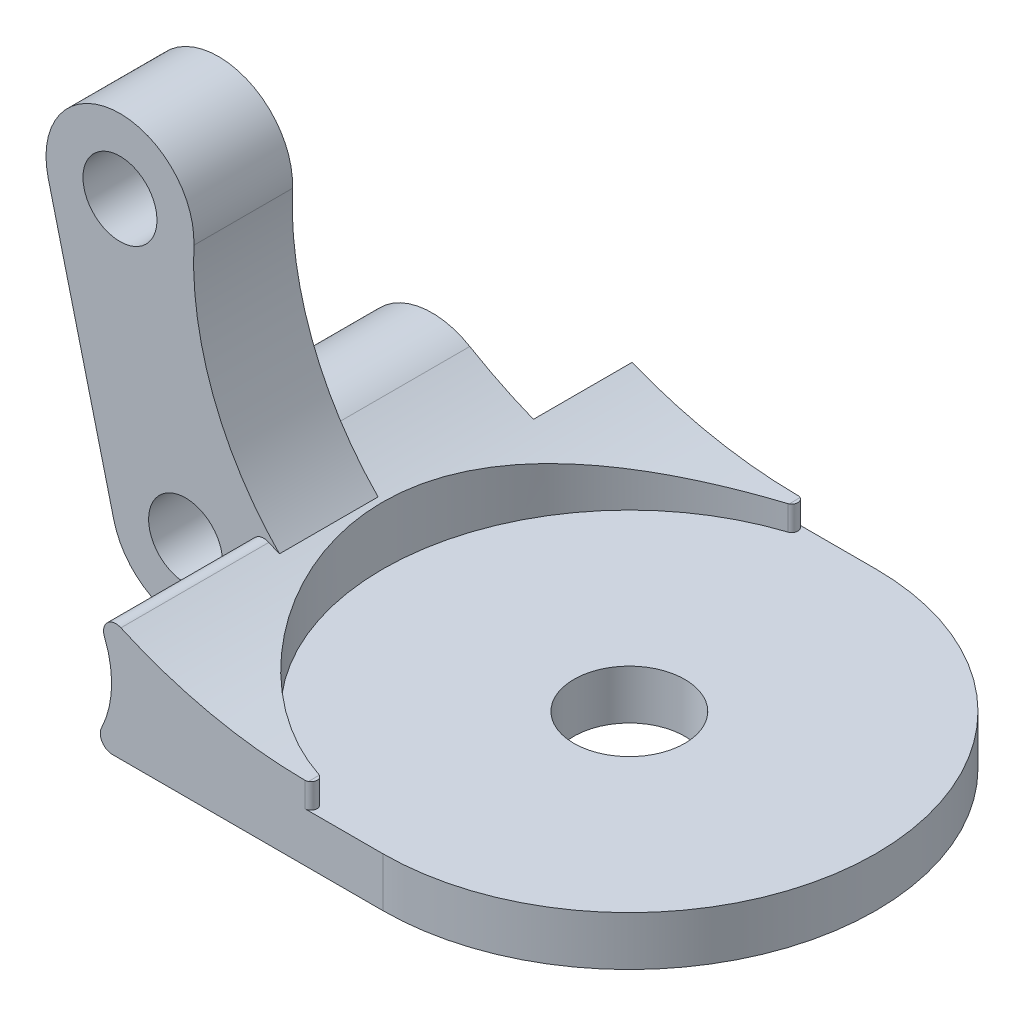
ISO-10303-21;
HEADER;
FILE_DESCRIPTION(('STEP AP214'),'2;1');
FILE_NAME('part.step','',(''),(''),'','','');
FILE_SCHEMA(('AUTOMOTIVE_DESIGN { 1 0 10303 214 1 1 1 1 }'));
ENDSEC;
DATA;
#1=APPLICATION_CONTEXT('core data for automotive mechanical design processes');
#2=APPLICATION_PROTOCOL_DEFINITION('international standard','automotive_design',2000,#1);
#3=PRODUCT_CONTEXT('',#1,'mechanical');
#4=PRODUCT('Part','Part','',(#3));
#5=PRODUCT_RELATED_PRODUCT_CATEGORY('part','',(#4));
#6=PRODUCT_DEFINITION_FORMATION('','',#4);
#7=PRODUCT_DEFINITION_CONTEXT('part definition',#1,'design');
#8=PRODUCT_DEFINITION('design','',#6,#7);
#9=PRODUCT_DEFINITION_SHAPE('','',#8);
#10=(LENGTH_UNIT() NAMED_UNIT(*) SI_UNIT(.MILLI.,.METRE.));
#11=(NAMED_UNIT(*) PLANE_ANGLE_UNIT() SI_UNIT($,.RADIAN.));
#12=(NAMED_UNIT(*) SI_UNIT($,.STERADIAN.) SOLID_ANGLE_UNIT());
#13=UNCERTAINTY_MEASURE_WITH_UNIT(LENGTH_MEASURE(1.E-05),#10,'distance_accuracy_value','');
#14=(GEOMETRIC_REPRESENTATION_CONTEXT(3) GLOBAL_UNCERTAINTY_ASSIGNED_CONTEXT((#13)) GLOBAL_UNIT_ASSIGNED_CONTEXT((#10,
#11,#12)) REPRESENTATION_CONTEXT('',''));
#15=CARTESIAN_POINT('',(0.,0.,0.));
#16=DIRECTION('',(0.,0.,1.));
#17=DIRECTION('',(1.,0.,0.));
#18=AXIS2_PLACEMENT_3D('',#15,#16,#17);
#19=CARTESIAN_POINT('',(-3.04554884989668,21.5,-10.));
#20=DIRECTION('',(0.,0.,1.));
#21=DIRECTION('',(-1.,0.,0.));
#22=AXIS2_PLACEMENT_3D('',#19,#20,#21);
#23=CYLINDRICAL_SURFACE('',#22,18.5);
#24=CARTESIAN_POINT('',(-3.04554884989668,21.5,0.));
#25=DIRECTION('',(0.,0.,1.));
#26=DIRECTION('',(1.,0.,0.));
#27=AXIS2_PLACEMENT_3D('',#24,#25,#26);
#28=CIRCLE('',#27,18.5);
#29=CARTESIAN_POINT('',(-10.1925249558174,4.43627436515113,0.));
#30=VERTEX_POINT('',#29);
#31=CARTESIAN_POINT('',(-12.4714719325437,5.58139534883721,0.));
#32=VERTEX_POINT('',#31);
#33=EDGE_CURVE('E177',#30,#32,#28,.F.);
#34=ORIENTED_EDGE('',*,*,#33,.F.);
#35=DIRECTION('',(0.,0.,1.));
#36=VECTOR('',#35,1.);
#37=CARTESIAN_POINT('',(-10.1925249558174,4.43627436515113,3.));
#38=LINE('',#37,#36);
#39=CARTESIAN_POINT('',(-10.1925249558174,4.43627436515113,4.));
#40=VERTEX_POINT('',#39);
#41=EDGE_CURVE('E175',#30,#40,#38,.T.);
#42=ORIENTED_EDGE('',*,*,#41,.T.);
#43=CARTESIAN_POINT('',(-3.04554884989668,21.5,4.));
#44=DIRECTION('',(0.,0.,-1.));
#45=DIRECTION('',(-1.,0.,0.));
#46=AXIS2_PLACEMENT_3D('',#43,#44,#45);
#47=CIRCLE('',#46,18.5);
#48=CARTESIAN_POINT('',(-10.6224737968789,4.62279026770719,4.));
#49=VERTEX_POINT('',#48);
#50=EDGE_CURVE('E349',#40,#49,#47,.T.);
#51=ORIENTED_EDGE('',*,*,#50,.T.);
#52=DIRECTION('',(0.,0.,1.));
#53=VECTOR('',#52,1.);
#54=CARTESIAN_POINT('',(-10.6224737968789,4.62279026770719,-10.));
#55=LINE('',#54,#53);
#56=CARTESIAN_POINT('',(-10.6224737968789,4.62279026770719,10.));
#57=VERTEX_POINT('',#56);
#58=EDGE_CURVE('E336',#57,#49,#55,.F.);
#59=ORIENTED_EDGE('',*,*,#58,.F.);
#60=CARTESIAN_POINT('',(-3.04554884989668,21.5,10.));
#61=DIRECTION('',(0.,0.,-1.));
#62=DIRECTION('',(-1.,0.,0.));
#63=AXIS2_PLACEMENT_3D('',#60,#61,#62);
#64=CIRCLE('',#63,18.5);
#65=CARTESIAN_POINT('',(-3.16227766016838,3.0003682635342,10.));
#66=VERTEX_POINT('',#65);
#67=EDGE_CURVE('E318',#57,#66,#64,.F.);
#68=ORIENTED_EDGE('',*,*,#67,.T.);
#69=CARTESIAN_POINT('',(-3.16227766016838,3.0003682635342,10.));
#70=CARTESIAN_POINT('',(-3.1480853813417,3.00027804290709,10.000015644037));
#71=CARTESIAN_POINT('',(-3.13388447461471,3.00020542840582,9.99879238895811));
#72=CARTESIAN_POINT('',(-3.10617274926587,3.0000944187745,9.99401613107568));
#73=CARTESIAN_POINT('',(-3.09265380670172,3.00005536764884,9.99051026220847));
#74=CARTESIAN_POINT('',(-3.07372003582073,3.00002051332476,9.98387129438531));
#75=CARTESIAN_POINT('',(-3.06798546811532,3.00001273660406,9.98161826192571));
#76=CARTESIAN_POINT('',(-3.05664720659696,3.00000246065968,9.97667306088629));
#77=CARTESIAN_POINT('',(-3.05104516087369,3.0000000096958,9.97397711283714));
#78=CARTESIAN_POINT('',(-3.04554884989668,3.,9.97107551843783));
#79=B_SPLINE_CURVE_WITH_KNOTS('',3,(#69,#70,#71,#72,#73,#74,#75,#76,#77,#78),.UNSPECIFIED.,.F.,
.F.,(4,2,2,2,4),(0.,0.0425439994481276,0.0842362303649804,0.102705805734802,0.121342058674472),.UNSPECIFIED.);
#80=CARTESIAN_POINT('',(-3.04554884989668,3.,9.97107551843782));
#81=VERTEX_POINT('',#80);
#82=EDGE_CURVE('E320',#66,#81,#79,.T.);
#83=ORIENTED_EDGE('',*,*,#82,.T.);
#84=DIRECTION('',(0.,0.,1.));
#85=VECTOR('',#84,1.);
#86=CARTESIAN_POINT('',(-3.04554884989668,3.,0.));
#87=LINE('',#86,#85);
#88=CARTESIAN_POINT('',(-3.04554884989668,3.,9.52892448156218));
#89=VERTEX_POINT('',#88);
#90=EDGE_CURVE('E262',#81,#89,#87,.F.);
#91=ORIENTED_EDGE('',*,*,#90,.T.);
#92=CARTESIAN_POINT('',(-3.04554884989668,3.,9.52892448156218));
#93=CARTESIAN_POINT('',(-3.05190870122854,2.99999974529206,9.52556774595884));
#94=CARTESIAN_POINT('',(-3.05838863413223,3.00000314984952,9.52249526485625));
#95=CARTESIAN_POINT('',(-3.07158866308321,3.00001727749524,9.51691881165259));
#96=CARTESIAN_POINT('',(-3.07830875913051,3.0000280005835,9.51441483955152));
#97=CARTESIAN_POINT('',(-3.08514893674962,3.00004238293716,9.51219512195119));
#98=B_SPLINE_CURVE_WITH_KNOTS('',3,(#92,#93,#94,#95,#96,#97),.UNSPECIFIED.,.F.,.F.,(4,2,4),(0.,
0.0215143472914588,0.0430286945827911),.UNSPECIFIED.);
#99=CARTESIAN_POINT('',(-3.08514893674964,3.00004238293716,9.51219512195122));
#100=VERTEX_POINT('',#99);
#101=EDGE_CURVE('E268',#89,#100,#98,.T.);
#102=ORIENTED_EDGE('',*,*,#101,.T.);
#103=CARTESIAN_POINT('',(-3.08514893674964,3.00004238293716,9.51219512195122));
#104=CARTESIAN_POINT('',(-3.34375948477036,3.00055533957409,9.42836322217349));
#105=CARTESIAN_POINT('',(-3.59885969231946,3.00656320139904,9.33392785749339));
#106=CARTESIAN_POINT('',(-4.10004762303463,3.02838642997198,9.12485938442509));
#107=CARTESIAN_POINT('',(-4.34614044395378,3.04419615551166,9.01023792076904));
#108=CARTESIAN_POINT('',(-4.82668994745182,3.08436607069219,8.76218968885334));
#109=CARTESIAN_POINT('',(-5.06118804985238,3.10869286758296,8.62883756291865));
#110=CARTESIAN_POINT('',(-5.51806622434353,3.16452602423865,8.34406375065127));
#111=CARTESIAN_POINT('',(-5.74044480458999,3.19603326541304,8.19263984707074));
#112=CARTESIAN_POINT('',(-6.17127935430581,3.26466860569798,7.87318810615199));
#113=CARTESIAN_POINT('',(-6.37976296766931,3.3017850332488,7.70519499234052));
#114=CARTESIAN_POINT('',(-6.78223591344763,3.3801429296113,7.35341667886423));
#115=CARTESIAN_POINT('',(-6.97622017223245,3.42138583066662,7.16962599921684));
#116=CARTESIAN_POINT('',(-7.34877393648276,3.50642335745003,6.78725559540884));
#117=CARTESIAN_POINT('',(-7.5273293341186,3.55022025849001,6.58866263897589));
#118=CARTESIAN_POINT('',(-7.86791187371115,3.63870724173569,6.17795586997929));
#119=CARTESIAN_POINT('',(-8.02993830921128,3.68339736202049,5.96584148013147));
#120=CARTESIAN_POINT('',(-8.34512598208159,3.77451335328896,5.51708014686157));
#121=CARTESIAN_POINT('',(-8.4972923848066,3.82089745270518,5.2797248788889));
#122=CARTESIAN_POINT('',(-8.78119193101754,3.91095288352785,4.79271175567846));
#123=CARTESIAN_POINT('',(-8.91293208475502,3.95462514253434,4.54305816013831));
#124=CARTESIAN_POINT('',(-9.15507395698833,4.03746622741688,4.03290579044189));
#125=CARTESIAN_POINT('',(-9.26547763253457,4.07663546619078,3.77240801361527));
#126=CARTESIAN_POINT('',(-9.46403924479765,4.14879968111384,3.24223364097852));
#127=CARTESIAN_POINT('',(-9.55219792711845,4.18179486419437,2.9725573531561));
#128=CARTESIAN_POINT('',(-9.704689480044,4.23985957361651,2.42858097126249));
#129=CARTESIAN_POINT('',(-9.7692469727602,4.26500346943213,2.1543519091016));
#130=CARTESIAN_POINT('',(-9.87506513907689,4.30665966820316,1.60077813563243));
#131=CARTESIAN_POINT('',(-9.91632593620938,4.32317201692779,1.32143345145813));
#132=CARTESIAN_POINT('',(-9.97507210782548,4.34678705090587,0.759980459873877));
#133=CARTESIAN_POINT('',(-9.99256801399594,4.35389390427771,0.477873432492562));
#134=CARTESIAN_POINT('',(-10.0036096970231,4.35837140966839,-0.0868786110712942));
#135=CARTESIAN_POINT('',(-9.99715674706311,4.3557425792614,-0.369523597856082));
#136=CARTESIAN_POINT('',(-9.96162148359995,4.34137938731528,-0.914037638366749));
#137=CARTESIAN_POINT('',(-9.93408946483071,4.3302689744324,-1.17602611745195));
#138=CARTESIAN_POINT('',(-9.85854202920388,4.30015186478646,-1.69655783114857));
#139=CARTESIAN_POINT('',(-9.81052758875707,4.28114554442774,-1.95510122938352));
#140=CARTESIAN_POINT('',(-9.69447212446267,4.23600027012829,-2.46700078063961));
#141=CARTESIAN_POINT('',(-9.62643152447513,4.20986146714968,-2.72035704332675));
#142=CARTESIAN_POINT('',(-9.47088408714956,4.15145646157184,-3.22039513502773));
#143=CARTESIAN_POINT('',(-9.38336959265147,4.11918784945617,-3.46707429568407));
#144=CARTESIAN_POINT('',(-9.18807988054015,4.04920549955487,-3.95594939128155));
#145=CARTESIAN_POINT('',(-9.08001405773094,4.01141572565752,-4.19801823218417));
#146=CARTESIAN_POINT('',(-8.84524581424566,3.93216395392889,-4.672441651066));
#147=CARTESIAN_POINT('',(-8.71853519033863,3.89070034291524,-4.9047918950282));
#148=CARTESIAN_POINT('',(-8.44725861594383,3.80560146346534,-5.35851765936131));
#149=CARTESIAN_POINT('',(-8.30268629843897,3.76196542396903,-5.57988922661522));
#150=CARTESIAN_POINT('',(-7.9965380367714,3.67409004510057,-6.0104207809255));
#151=CARTESIAN_POINT('',(-7.83496154887912,3.62985068647592,-6.21958037715616));
#152=CARTESIAN_POINT('',(-7.48384715070279,3.53930371311177,-6.63866350881956));
#153=CARTESIAN_POINT('',(-7.29314636843003,3.49306604764083,-6.84762980391476));
#154=CARTESIAN_POINT('',(-6.89444155889461,3.40365368583366,-7.24890696257339));
#155=CARTESIAN_POINT('',(-6.68644379275847,3.36047789156267,-7.441223801865));
#156=CARTESIAN_POINT('',(-6.25451673604423,3.27911260379688,-7.80776110679517));
#157=CARTESIAN_POINT('',(-6.03060450449051,3.24091789190206,-7.98200047140674));
#158=CARTESIAN_POINT('',(-5.56817957862755,3.17130558810468,-8.31119466539471));
#159=CARTESIAN_POINT('',(-5.32967163486971,3.13988580602933,-8.46615572011384));
#160=CARTESIAN_POINT('',(-4.77014221334346,3.07785014210383,-8.79652493371539));
#161=CARTESIAN_POINT('',(-4.44485013591344,3.0499706499199,-8.96533605476174));
#162=CARTESIAN_POINT('',(-3.94400782918979,3.0210700869984,-9.19121603747753));
#163=CARTESIAN_POINT('',(-3.7748514400196,3.01358934261343,-9.26197217953963));
#164=CARTESIAN_POINT('',(-3.43272065563493,3.00325929164313,-9.39415026003931));
#165=CARTESIAN_POINT('',(-3.2597448566753,3.00041171759843,-9.45556869893083));
#166=CARTESIAN_POINT('',(-3.08514893674963,3.00004238293717,-9.51219512195122));
#167=B_SPLINE_CURVE_WITH_KNOTS('',3,(#103,#104,#105,#106,#107,#108,#109,#110,#111,#112,#113,
#114,#115,#116,#117,#118,#119,#120,#121,#122,#123,#124,#125,#126,#127,#128,#129,#130,#131,#132,
#133,#134,#135,#136,#137,#138,#139,#140,#141,#142,#143,#144,#145,#146,#147,#148,#149,#150,#151,
#152,#153,#154,#155,#156,#157,#158,#159,#160,#161,#162,#163,#164,#165,#166),.UNSPECIFIED.,.F.,
.F.,(4,2,2,2,2,2,2,2,2,2,2,2,2,2,2,2,2,2,2,2,2,2,2,2,2,2,2,2,2,2,2,4),(0.,0.815211361127926,
1.62995398347844,2.44153738248569,3.25322045818732,4.06323726973291,4.8735362090384,
5.6845683969265,6.49563523424888,7.35182898682674,8.20772824172615,9.06354895349464,
9.9193409761969,10.7667618849982,11.6141783002614,12.4612190504607,13.3082147704246,
14.0982757596736,14.8882990903927,15.6783057012177,16.4686234942692,17.2710827161575,
18.0738960609496,18.876996408451,19.6801224438962,20.5390669011686,21.3977017816965,
22.2554297660529,23.1128800503628,24.2126428724185,24.7628894570447,25.3133417551602),.UNSPECIFIED.);
#168=CARTESIAN_POINT('',(-3.08514893674963,3.00004238293716,-9.51219512195122));
#169=VERTEX_POINT('',#168);
#170=EDGE_CURVE('E277',#100,#169,#167,.T.);
#171=ORIENTED_EDGE('',*,*,#170,.T.);
#172=CARTESIAN_POINT('',(-3.08514893674963,3.00004238293716,-9.51219512195122));
#173=CARTESIAN_POINT('',(-3.07830875913051,3.00002800058351,-9.51441483955154));
#174=CARTESIAN_POINT('',(-3.07158866308322,3.00001727749525,-9.51691881165261));
#175=CARTESIAN_POINT('',(-3.05838863413223,3.00000314984952,-9.52249526485624));
#176=CARTESIAN_POINT('',(-3.05190870122853,2.99999974529206,-9.52556774595882));
#177=CARTESIAN_POINT('',(-3.04554884989667,2.99999999999999,-9.52892448156214));
#178=B_SPLINE_CURVE_WITH_KNOTS('',3,(#172,#173,#174,#175,#176,#177),.UNSPECIFIED.,.F.,.F.,(4,2,
4),(0.,0.0215143472913285,0.0430286945827812),.UNSPECIFIED.);
#179=CARTESIAN_POINT('',(-3.04554884989668,3.,-9.52892448156217));
#180=VERTEX_POINT('',#179);
#181=EDGE_CURVE('E302',#169,#180,#178,.T.);
#182=ORIENTED_EDGE('',*,*,#181,.T.);
#183=DIRECTION('',(0.,0.,1.));
#184=VECTOR('',#183,1.);
#185=CARTESIAN_POINT('',(-3.04554884989668,3.,0.));
#186=LINE('',#185,#184);
#187=CARTESIAN_POINT('',(-3.04554884989668,3.,-9.97107551843783));
#188=VERTEX_POINT('',#187);
#189=EDGE_CURVE('E259',#180,#188,#186,.F.);
#190=ORIENTED_EDGE('',*,*,#189,.T.);
#191=CARTESIAN_POINT('',(-3.04554884989668,3.,-9.97107551843783));
#192=CARTESIAN_POINT('',(-3.05809206086548,2.9999993917057,-9.97771607661325));
#193=CARTESIAN_POINT('',(-3.07122128576662,3.00001271934005,-9.98326500967602));
#194=CARTESIAN_POINT('',(-3.09795710215626,3.00006966284216,-9.99198037388416));
#195=CARTESIAN_POINT('',(-3.11154887366791,3.00011266697014,-9.99519228063992));
#196=CARTESIAN_POINT('',(-3.13139173756224,3.00019813922736,-9.99816183103056));
#197=CARTESIAN_POINT('',(-3.13751473920206,3.00022756382609,-9.99884700811873));
#198=CARTESIAN_POINT('',(-3.14985001000346,3.00029299058574,-9.99976793571782));
#199=CARTESIAN_POINT('',(-3.15606258609397,3.00032904970913,-9.99999957460357));
#200=CARTESIAN_POINT('',(-3.16227766016837,3.0003682635342,-10.));
#201=B_SPLINE_CURVE_WITH_KNOTS('',3,(#191,#192,#193,#194,#195,#196,#197,#198,#199,#200),
.UNSPECIFIED.,.F.,.F.,(4,2,2,2,4),(0.,0.0425439996769928,0.0842362303421861,0.102705805693901,
0.12134205865309),.UNSPECIFIED.);
#202=CARTESIAN_POINT('',(-3.16227766016837,3.0003682635342,-10.));
#203=VERTEX_POINT('',#202);
#204=EDGE_CURVE('E308',#188,#203,#201,.T.);
#205=ORIENTED_EDGE('',*,*,#204,.T.);
#206=CARTESIAN_POINT('',(-3.04554884989668,21.5,-10.));
#207=DIRECTION('',(0.,0.,1.));
#208=DIRECTION('',(1.,0.,0.));
#209=AXIS2_PLACEMENT_3D('',#206,#207,#208);
#210=CIRCLE('',#209,18.5);
#211=CARTESIAN_POINT('',(-9.89074408045117,4.3129903050125,-10.));
#212=VERTEX_POINT('',#211);
#213=EDGE_CURVE('E315',#203,#212,#210,.F.);
#214=ORIENTED_EDGE('',*,*,#213,.T.);
#215=DIRECTION('',(0.,0.,-1.));
#216=VECTOR('',#215,1.);
#217=CARTESIAN_POINT('',(-9.89074408045117,4.3129903050125,-6.));
#218=LINE('',#217,#216);
#219=CARTESIAN_POINT('',(-9.89074408045117,4.31299030501251,-6.));
#220=VERTEX_POINT('',#219);
#221=EDGE_CURVE('E197',#220,#212,#218,.T.);
#222=ORIENTED_EDGE('',*,*,#221,.F.);
#223=CARTESIAN_POINT('',(-3.04554884989668,21.5,-6.));
#224=DIRECTION('',(0.,0.,1.));
#225=DIRECTION('',(1.,0.,0.));
#226=AXIS2_PLACEMENT_3D('',#223,#224,#225);
#227=CIRCLE('',#226,18.5);
#228=CARTESIAN_POINT('',(-12.4714719325437,5.58139534883721,-6.));
#229=VERTEX_POINT('',#228);
#230=EDGE_CURVE('E191',#220,#229,#227,.F.);
#231=ORIENTED_EDGE('',*,*,#230,.T.);
#232=DIRECTION('',(0.,0.,1.));
#233=VECTOR('',#232,1.);
#234=CARTESIAN_POINT('',(-12.4714719325437,5.58139534883721,-10.));
#235=LINE('',#234,#233);
#236=EDGE_CURVE('E265',#229,#32,#235,.T.);
#237=ORIENTED_EDGE('',*,*,#236,.T.);
#238=EDGE_LOOP('',(#34,#42,#51,#59,#68,#83,#91,#102,#171,#182,#190,#205,#214,#222,#231,#237));
#239=FACE_BOUND('',#238,.T.);
#240=ADVANCED_FACE('F64',(#239),#23,.F.);
#241=CARTESIAN_POINT('',(-14.,3.,-10.));
#242=DIRECTION('',(0.,0.,1.));
#243=DIRECTION('',(-1.,0.,0.));
#244=AXIS2_PLACEMENT_3D('',#241,#242,#243);
#245=CYLINDRICAL_SURFACE('',#244,3.);
#246=CARTESIAN_POINT('',(-14.,3.,0.));
#247=DIRECTION('',(0.,0.,1.));
#248=DIRECTION('',(1.,0.,0.));
#249=AXIS2_PLACEMENT_3D('',#246,#247,#248);
#250=CIRCLE('',#249,3.);
#251=CARTESIAN_POINT('',(-16.910887178828,2.27423431320099,0.));
#252=VERTEX_POINT('',#251);
#253=EDGE_CURVE('E167',#252,#32,#250,.F.);
#254=ORIENTED_EDGE('',*,*,#253,.T.);
#255=ORIENTED_EDGE('',*,*,#236,.F.);
#256=CARTESIAN_POINT('',(-14.,3.,-6.));
#257=DIRECTION('',(0.,0.,1.));
#258=DIRECTION('',(1.,0.,0.));
#259=AXIS2_PLACEMENT_3D('',#256,#257,#258);
#260=CIRCLE('',#259,3.);
#261=CARTESIAN_POINT('',(-14.,0.,-6.));
#262=VERTEX_POINT('',#261);
#263=EDGE_CURVE('E181',#229,#262,#260,.T.);
#264=ORIENTED_EDGE('',*,*,#263,.T.);
#265=DIRECTION('',(0.,0.,1.));
#266=VECTOR('',#265,1.);
#267=CARTESIAN_POINT('',(-14.,0.,-10.));
#268=LINE('',#267,#266);
#269=CARTESIAN_POINT('',(-14.,0.,4.));
#270=VERTEX_POINT('',#269);
#271=EDGE_CURVE('E211',#262,#270,#268,.T.);
#272=ORIENTED_EDGE('',*,*,#271,.T.);
#273=CARTESIAN_POINT('',(-14.,3.,4.));
#274=DIRECTION('',(0.,0.,-1.));
#275=DIRECTION('',(-1.,0.,0.));
#276=AXIS2_PLACEMENT_3D('',#273,#274,#275);
#277=CIRCLE('',#276,3.);
#278=CARTESIAN_POINT('',(-16.910887178828,2.27423431320099,4.));
#279=VERTEX_POINT('',#278);
#280=EDGE_CURVE('E204',#270,#279,#277,.T.);
#281=ORIENTED_EDGE('',*,*,#280,.T.);
#282=DIRECTION('',(0.,0.,1.));
#283=VECTOR('',#282,1.);
#284=CARTESIAN_POINT('',(-16.910887178828,2.27423431320099,3.));
#285=LINE('',#284,#283);
#286=EDGE_CURVE('E173',#252,#279,#285,.T.);
#287=ORIENTED_EDGE('',*,*,#286,.F.);
#288=EDGE_LOOP('',(#254,#255,#264,#272,#281,#287));
#289=FACE_BOUND('',#288,.T.);
#290=ADVANCED_FACE('F291',(#289),#245,.T.);
#291=CARTESIAN_POINT('',(0.,0.,0.));
#292=DIRECTION('',(0.,1.,0.));
#293=DIRECTION('',(0.,0.,-1.));
#294=AXIS2_PLACEMENT_3D('',#291,#292,#293);
#295=PLANE('',#294);
#296=CARTESIAN_POINT('',(0.,0.,0.));
#297=DIRECTION('',(0.,1.,0.));
#298=DIRECTION('',(0.,0.,1.));
#299=AXIS2_PLACEMENT_3D('',#296,#297,#298);
#300=CIRCLE('',#299,2.25);
#301=CARTESIAN_POINT('',(0.,0.,2.25));
#302=VERTEX_POINT('',#301);
#303=EDGE_CURVE('E347',#302,#302,#300,.T.);
#304=ORIENTED_EDGE('',*,*,#303,.T.);
#305=EDGE_LOOP('',(#304));
#306=FACE_BOUND('',#305,.T.);
#307=DIRECTION('',(0.,0.,-1.));
#308=VECTOR('',#307,1.);
#309=CARTESIAN_POINT('',(-11.0464063496425,0.,-6.));
#310=LINE('',#309,#308);
#311=CARTESIAN_POINT('',(-11.0464063496425,0.,-6.));
#312=VERTEX_POINT('',#311);
#313=CARTESIAN_POINT('',(-11.0464063496425,0.,-10.));
#314=VERTEX_POINT('',#313);
#315=EDGE_CURVE('E195',#312,#314,#310,.T.);
#316=ORIENTED_EDGE('',*,*,#315,.T.);
#317=DIRECTION('',(-1.,0.,0.));
#318=VECTOR('',#317,1.);
#319=CARTESIAN_POINT('',(0.,0.,-10.));
#320=LINE('',#319,#318);
#321=CARTESIAN_POINT('',(0.,0.,-10.));
#322=VERTEX_POINT('',#321);
#323=EDGE_CURVE('E208',#322,#314,#320,.T.);
#324=ORIENTED_EDGE('',*,*,#323,.F.);
#325=CARTESIAN_POINT('',(0.,0.,0.));
#326=DIRECTION('',(0.,-1.,0.));
#327=DIRECTION('',(0.,0.,-1.));
#328=AXIS2_PLACEMENT_3D('',#325,#326,#327);
#329=CIRCLE('',#328,10.);
#330=CARTESIAN_POINT('',(0.,0.,10.));
#331=VERTEX_POINT('',#330);
#332=EDGE_CURVE('E220',#322,#331,#329,.T.);
#333=ORIENTED_EDGE('',*,*,#332,.T.);
#334=DIRECTION('',(1.,0.,0.));
#335=VECTOR('',#334,1.);
#336=CARTESIAN_POINT('',(0.,0.,10.));
#337=LINE('',#336,#335);
#338=CARTESIAN_POINT('',(-10.9599673040044,0.,10.));
#339=VERTEX_POINT('',#338);
#340=EDGE_CURVE('E214',#339,#331,#337,.T.);
#341=ORIENTED_EDGE('',*,*,#340,.F.);
#342=DIRECTION('',(0.,0.,1.));
#343=VECTOR('',#342,1.);
#344=CARTESIAN_POINT('',(-10.9599673040044,0.,0.));
#345=LINE('',#344,#343);
#346=CARTESIAN_POINT('',(-10.9599673040044,0.,4.));
#347=VERTEX_POINT('',#346);
#348=EDGE_CURVE('E327',#347,#339,#345,.T.);
#349=ORIENTED_EDGE('',*,*,#348,.F.);
#350=DIRECTION('',(-1.,0.,0.));
#351=VECTOR('',#350,1.);
#352=CARTESIAN_POINT('',(0.,0.,4.));
#353=LINE('',#352,#351);
#354=EDGE_CURVE('E68',#347,#270,#353,.T.);
#355=ORIENTED_EDGE('',*,*,#354,.T.);
#356=ORIENTED_EDGE('',*,*,#271,.F.);
#357=DIRECTION('',(1.,0.,0.));
#358=VECTOR('',#357,1.);
#359=CARTESIAN_POINT('',(0.,0.,-6.));
#360=LINE('',#359,#358);
#361=EDGE_CURVE('E184',#262,#312,#360,.T.);
#362=ORIENTED_EDGE('',*,*,#361,.T.);
#363=EDGE_LOOP('',(#316,#324,#333,#341,#349,#355,#356,#362));
#364=FACE_BOUND('',#363,.T.);
#365=ADVANCED_FACE('F436',(#306,#364),#295,.F.);
#366=CARTESIAN_POINT('',(0.,3.,-10.));
#367=DIRECTION('',(0.,0.,-1.));
#368=DIRECTION('',(1.,0.,0.));
#369=AXIS2_PLACEMENT_3D('',#366,#367,#368);
#370=PLANE('',#369);
#371=ORIENTED_EDGE('',*,*,#213,.F.);
#372=DIRECTION('',(0.,-1.,0.));
#373=VECTOR('',#372,1.);
#374=CARTESIAN_POINT('',(-3.16227766016837,3.,-10.));
#375=LINE('',#374,#373);
#376=CARTESIAN_POINT('',(-3.16227766016837,2.,-10.));
#377=VERTEX_POINT('',#376);
#378=EDGE_CURVE('E246',#377,#203,#375,.F.);
#379=ORIENTED_EDGE('',*,*,#378,.F.);
#380=DIRECTION('',(-1.,0.,0.));
#381=VECTOR('',#380,1.);
#382=CARTESIAN_POINT('',(0.,2.,-10.));
#383=LINE('',#382,#381);
#384=CARTESIAN_POINT('',(0.,2.,-10.));
#385=VERTEX_POINT('',#384);
#386=EDGE_CURVE('E249',#385,#377,#383,.T.);
#387=ORIENTED_EDGE('',*,*,#386,.F.);
#388=DIRECTION('',(0.,-1.,0.));
#389=VECTOR('',#388,1.);
#390=CARTESIAN_POINT('',(0.,3.,-10.));
#391=LINE('',#390,#389);
#392=EDGE_CURVE('E216',#385,#322,#391,.T.);
#393=ORIENTED_EDGE('',*,*,#392,.T.);
#394=ORIENTED_EDGE('',*,*,#323,.T.);
#395=DIRECTION('',(-0.258819045102518,-0.965925826289069,0.));
#396=VECTOR('',#395,1.);
#397=CARTESIAN_POINT('',(-10.3064374344793,2.7616015874106,-10.));
#398=LINE('',#397,#396);
#399=EDGE_CURVE('E185',#212,#314,#398,.T.);
#400=ORIENTED_EDGE('',*,*,#399,.F.);
#401=EDGE_LOOP('',(#371,#379,#387,#393,#394,#400));
#402=FACE_BOUND('',#401,.T.);
#403=ADVANCED_FACE('F431',(#402),#370,.T.);
#404=CARTESIAN_POINT('',(0.,3.,0.));
#405=DIRECTION('',(0.,1.,0.));
#406=DIRECTION('',(0.,0.,-1.));
#407=AXIS2_PLACEMENT_3D('',#404,#405,#406);
#408=PLANE('',#407);
#409=CARTESIAN_POINT('',(-3.16227766016838,3.,9.75));
#410=DIRECTION('',(0.,-1.,0.));
#411=DIRECTION('',(0.,0.,-1.));
#412=AXIS2_PLACEMENT_3D('',#409,#410,#411);
#413=CIRCLE('',#412,0.25);
#414=EDGE_CURVE('E243',#89,#81,#413,.T.);
#415=ORIENTED_EDGE('',*,*,#414,.F.);
#416=ORIENTED_EDGE('',*,*,#90,.F.);
#417=EDGE_LOOP('',(#415,#416));
#418=FACE_BOUND('',#417,.T.);
#419=ADVANCED_FACE('F391',(#418),#408,.T.);
#420=CARTESIAN_POINT('',(-3.16227766016837,3.,-9.75));
#421=DIRECTION('',(0.,-1.,0.));
#422=DIRECTION('',(0.,0.,-1.));
#423=AXIS2_PLACEMENT_3D('',#420,#421,#422);
#424=CIRCLE('',#423,0.25);
#425=EDGE_CURVE('E240',#188,#180,#424,.T.);
#426=ORIENTED_EDGE('',*,*,#425,.F.);
#427=ORIENTED_EDGE('',*,*,#189,.F.);
#428=EDGE_LOOP('',(#426,#427));
#429=FACE_BOUND('',#428,.T.);
#430=ADVANCED_FACE('F385',(#429),#408,.T.);
#431=CARTESIAN_POINT('',(0.,2.,0.));
#432=DIRECTION('',(0.,-1.,0.));
#433=DIRECTION('',(0.,0.,1.));
#434=AXIS2_PLACEMENT_3D('',#431,#432,#433);
#435=CYLINDRICAL_SURFACE('',#434,10.);
#436=DIRECTION('',(0.,-1.,0.));
#437=VECTOR('',#436,1.);
#438=CARTESIAN_POINT('',(0.,3.,10.));
#439=LINE('',#438,#437);
#440=CARTESIAN_POINT('',(0.,2.,10.));
#441=VERTEX_POINT('',#440);
#442=EDGE_CURVE('E217',#441,#331,#439,.T.);
#443=ORIENTED_EDGE('',*,*,#442,.T.);
#444=ORIENTED_EDGE('',*,*,#332,.F.);
#445=ORIENTED_EDGE('',*,*,#392,.F.);
#446=CARTESIAN_POINT('',(0.,2.,0.));
#447=DIRECTION('',(0.,-1.,0.));
#448=DIRECTION('',(0.,0.,-1.));
#449=AXIS2_PLACEMENT_3D('',#446,#447,#448);
#450=CIRCLE('',#449,10.);
#451=EDGE_CURVE('E223',#385,#441,#450,.T.);
#452=ORIENTED_EDGE('',*,*,#451,.T.);
#453=EDGE_LOOP('',(#443,#444,#445,#452));
#454=FACE_BOUND('',#453,.T.);
#455=ADVANCED_FACE('F390',(#454),#435,.T.);
#456=CARTESIAN_POINT('',(0.,2.,0.));
#457=DIRECTION('',(0.,1.,0.));
#458=DIRECTION('',(0.,0.,-1.));
#459=AXIS2_PLACEMENT_3D('',#456,#457,#458);
#460=PLANE('',#459);
#461=CARTESIAN_POINT('',(0.,2.,0.));
#462=DIRECTION('',(0.,1.,0.));
#463=DIRECTION('',(0.,0.,1.));
#464=AXIS2_PLACEMENT_3D('',#461,#462,#463);
#465=CIRCLE('',#464,2.25);
#466=CARTESIAN_POINT('',(0.,2.,2.25));
#467=VERTEX_POINT('',#466);
#468=EDGE_CURVE('E612',#467,#467,#465,.T.);
#469=ORIENTED_EDGE('',*,*,#468,.F.);
#470=EDGE_LOOP('',(#469));
#471=FACE_BOUND('',#470,.T.);
#472=ORIENTED_EDGE('',*,*,#451,.F.);
#473=ORIENTED_EDGE('',*,*,#386,.T.);
#474=CARTESIAN_POINT('',(-3.16227766016837,2.,-9.75));
#475=DIRECTION('',(0.,-1.,0.));
#476=DIRECTION('',(0.,0.,-1.));
#477=AXIS2_PLACEMENT_3D('',#474,#475,#476);
#478=CIRCLE('',#477,0.25);
#479=CARTESIAN_POINT('',(-3.08514893674963,2.,-9.51219512195122));
#480=VERTEX_POINT('',#479);
#481=EDGE_CURVE('E255',#480,#377,#478,.F.);
#482=ORIENTED_EDGE('',*,*,#481,.F.);
#483=CARTESIAN_POINT('',(0.,2.,0.));
#484=DIRECTION('',(0.,-1.,0.));
#485=DIRECTION('',(0.,0.,-1.));
#486=AXIS2_PLACEMENT_3D('',#483,#484,#485);
#487=CIRCLE('',#486,10.);
#488=CARTESIAN_POINT('',(-3.08514893674964,2.,9.51219512195122));
#489=VERTEX_POINT('',#488);
#490=EDGE_CURVE('E205',#489,#480,#487,.T.);
#491=ORIENTED_EDGE('',*,*,#490,.F.);
#492=CARTESIAN_POINT('',(-3.16227766016838,2.,9.75));
#493=DIRECTION('',(0.,-1.,0.));
#494=DIRECTION('',(0.,0.,-1.));
#495=AXIS2_PLACEMENT_3D('',#492,#493,#494);
#496=CIRCLE('',#495,0.25);
#497=CARTESIAN_POINT('',(-3.16227766016838,2.,10.));
#498=VERTEX_POINT('',#497);
#499=EDGE_CURVE('E252',#498,#489,#496,.F.);
#500=ORIENTED_EDGE('',*,*,#499,.F.);
#501=DIRECTION('',(1.,0.,0.));
#502=VECTOR('',#501,1.);
#503=CARTESIAN_POINT('',(0.,2.,10.));
#504=LINE('',#503,#502);
#505=EDGE_CURVE('E226',#498,#441,#504,.T.);
#506=ORIENTED_EDGE('',*,*,#505,.T.);
#507=EDGE_LOOP('',(#472,#473,#482,#491,#500,#506));
#508=FACE_BOUND('',#507,.T.);
#509=ADVANCED_FACE('F425',(#471,#508),#460,.T.);
#510=CARTESIAN_POINT('',(0.,3.,10.));
#511=DIRECTION('',(0.,0.,1.));
#512=DIRECTION('',(-1.,0.,0.));
#513=AXIS2_PLACEMENT_3D('',#510,#511,#512);
#514=PLANE('',#513);
#515=ORIENTED_EDGE('',*,*,#340,.T.);
#516=ORIENTED_EDGE('',*,*,#442,.F.);
#517=ORIENTED_EDGE('',*,*,#505,.F.);
#518=DIRECTION('',(0.,-1.,0.));
#519=VECTOR('',#518,1.);
#520=CARTESIAN_POINT('',(-3.16227766016838,3.,10.));
#521=LINE('',#520,#519);
#522=EDGE_CURVE('E231',#66,#498,#521,.T.);
#523=ORIENTED_EDGE('',*,*,#522,.F.);
#524=ORIENTED_EDGE('',*,*,#67,.F.);
#525=CARTESIAN_POINT('',(-10.8272555522027,4.16664946413171,10.));
#526=DIRECTION('',(0.,0.,-1.));
#527=DIRECTION('',(-1.,0.,0.));
#528=AXIS2_PLACEMENT_3D('',#525,#526,#527);
#529=CIRCLE('',#528,0.5);
#530=CARTESIAN_POINT('',(-11.2908938241802,3.97946091544953,10.));
#531=VERTEX_POINT('',#530);
#532=EDGE_CURVE('E329',#531,#57,#529,.T.);
#533=ORIENTED_EDGE('',*,*,#532,.F.);
#534=CARTESIAN_POINT('',(-15.,2.48195252599214,10.));
#535=DIRECTION('',(0.,0.,-1.));
#536=DIRECTION('',(-1.,0.,0.));
#537=AXIS2_PLACEMENT_3D('',#534,#535,#536);
#538=CIRCLE('',#537,4.);
#539=CARTESIAN_POINT('',(-11.4088598257817,0.72021694733246,10.));
#540=VERTEX_POINT('',#539);
#541=EDGE_CURVE('E200',#531,#540,#538,.T.);
#542=ORIENTED_EDGE('',*,*,#541,.T.);
#543=CARTESIAN_POINT('',(-10.9599673040044,0.5,10.));
#544=DIRECTION('',(0.,0.,-1.));
#545=DIRECTION('',(-1.,0.,0.));
#546=AXIS2_PLACEMENT_3D('',#543,#544,#545);
#547=CIRCLE('',#546,0.5);
#548=EDGE_CURVE('E131',#339,#540,#547,.T.);
#549=ORIENTED_EDGE('',*,*,#548,.F.);
#550=EDGE_LOOP('',(#515,#516,#517,#523,#524,#533,#542,#549));
#551=FACE_BOUND('',#550,.T.);
#552=ADVANCED_FACE('F406',(#551),#514,.T.);
#553=CARTESIAN_POINT('',(0.,5.,0.));
#554=DIRECTION('',(0.,-1.,0.));
#555=DIRECTION('',(0.,0.,1.));
#556=AXIS2_PLACEMENT_3D('',#553,#554,#555);
#557=CYLINDRICAL_SURFACE('',#556,10.);
#558=ORIENTED_EDGE('',*,*,#490,.T.);
#559=DIRECTION('',(0.,-1.,0.));
#560=VECTOR('',#559,1.);
#561=CARTESIAN_POINT('',(-3.08514893674963,5.,-9.51219512195122));
#562=LINE('',#561,#560);
#563=EDGE_CURVE('E234',#169,#480,#562,.T.);
#564=ORIENTED_EDGE('',*,*,#563,.F.);
#565=ORIENTED_EDGE('',*,*,#170,.F.);
#566=DIRECTION('',(0.,-1.,0.));
#567=VECTOR('',#566,1.);
#568=CARTESIAN_POINT('',(-3.08514893674964,5.,9.51219512195122));
#569=LINE('',#568,#567);
#570=EDGE_CURVE('E237',#489,#100,#569,.F.);
#571=ORIENTED_EDGE('',*,*,#570,.F.);
#572=EDGE_LOOP('',(#558,#564,#565,#571));
#573=FACE_BOUND('',#572,.T.);
#574=ADVANCED_FACE('F401',(#573),#557,.F.);
#575=CARTESIAN_POINT('',(-3.16227766016838,5.,9.75));
#576=DIRECTION('',(0.,-1.,0.));
#577=DIRECTION('',(0.,0.,1.));
#578=AXIS2_PLACEMENT_3D('',#575,#576,#577);
#579=CYLINDRICAL_SURFACE('',#578,0.25);
#580=ORIENTED_EDGE('',*,*,#414,.T.);
#581=ORIENTED_EDGE('',*,*,#82,.F.);
#582=ORIENTED_EDGE('',*,*,#522,.T.);
#583=ORIENTED_EDGE('',*,*,#499,.T.);
#584=ORIENTED_EDGE('',*,*,#570,.T.);
#585=ORIENTED_EDGE('',*,*,#101,.F.);
#586=EDGE_LOOP('',(#580,#581,#582,#583,#584,#585));
#587=FACE_BOUND('',#586,.T.);
#588=ADVANCED_FACE('F284',(#587),#579,.T.);
#589=CARTESIAN_POINT('',(-3.16227766016837,5.,-9.75));
#590=DIRECTION('',(0.,-1.,0.));
#591=DIRECTION('',(0.,0.,1.));
#592=AXIS2_PLACEMENT_3D('',#589,#590,#591);
#593=CYLINDRICAL_SURFACE('',#592,0.25);
#594=ORIENTED_EDGE('',*,*,#425,.T.);
#595=ORIENTED_EDGE('',*,*,#181,.F.);
#596=ORIENTED_EDGE('',*,*,#563,.T.);
#597=ORIENTED_EDGE('',*,*,#481,.T.);
#598=ORIENTED_EDGE('',*,*,#378,.T.);
#599=ORIENTED_EDGE('',*,*,#204,.F.);
#600=EDGE_LOOP('',(#594,#595,#596,#597,#598,#599));
#601=FACE_BOUND('',#600,.T.);
#602=ADVANCED_FACE('F293',(#601),#593,.T.);
#603=CARTESIAN_POINT('',(-15.,2.48195252599214,6.));
#604=DIRECTION('',(0.,0.,1.));
#605=DIRECTION('',(-1.,0.,0.));
#606=AXIS2_PLACEMENT_3D('',#603,#604,#605);
#607=CYLINDRICAL_SURFACE('',#606,4.);
#608=ORIENTED_EDGE('',*,*,#541,.F.);
#609=DIRECTION('',(0.,0.,1.));
#610=VECTOR('',#609,1.);
#611=CARTESIAN_POINT('',(-11.2908938241802,3.97946091544953,6.));
#612=LINE('',#611,#610);
#613=CARTESIAN_POINT('',(-11.2908938241802,3.97946091544953,4.));
#614=VERTEX_POINT('',#613);
#615=EDGE_CURVE('E332',#614,#531,#612,.T.);
#616=ORIENTED_EDGE('',*,*,#615,.F.);
#617=CARTESIAN_POINT('',(-15.,2.48195252599214,4.));
#618=DIRECTION('',(0.,0.,-1.));
#619=DIRECTION('',(-1.,0.,0.));
#620=AXIS2_PLACEMENT_3D('',#617,#618,#619);
#621=CIRCLE('',#620,4.);
#622=CARTESIAN_POINT('',(-11.4088598257817,0.72021694733246,4.));
#623=VERTEX_POINT('',#622);
#624=EDGE_CURVE('E358',#614,#623,#621,.T.);
#625=ORIENTED_EDGE('',*,*,#624,.T.);
#626=DIRECTION('',(0.,0.,1.));
#627=VECTOR('',#626,1.);
#628=CARTESIAN_POINT('',(-11.4088598257817,0.72021694733246,6.));
#629=LINE('',#628,#627);
#630=EDGE_CURVE('E334',#540,#623,#629,.F.);
#631=ORIENTED_EDGE('',*,*,#630,.F.);
#632=EDGE_LOOP('',(#608,#616,#625,#631));
#633=FACE_BOUND('',#632,.T.);
#634=ADVANCED_FACE('F525',(#633),#607,.F.);
#635=CARTESIAN_POINT('',(0.,0.,4.));
#636=DIRECTION('',(0.,0.,1.));
#637=DIRECTION('',(-1.,0.,0.));
#638=AXIS2_PLACEMENT_3D('',#635,#636,#637);
#639=PLANE('',#638);
#640=CARTESIAN_POINT('',(-16.6611408515964,13.673252989036,4.));
#641=DIRECTION('',(0.,0.,-1.));
#642=DIRECTION('',(-1.,0.,0.));
#643=AXIS2_PLACEMENT_3D('',#640,#641,#642);
#644=CIRCLE('',#643,1.5);
#645=CARTESIAN_POINT('',(-18.1611408515964,13.673252989036,4.));
#646=VERTEX_POINT('',#645);
#647=EDGE_CURVE('E343',#646,#646,#644,.T.);
#648=ORIENTED_EDGE('',*,*,#647,.T.);
#649=EDGE_LOOP('',(#648));
#650=FACE_BOUND('',#649,.T.);
#651=CARTESIAN_POINT('',(-14.,3.,4.));
#652=DIRECTION('',(0.,0.,-1.));
#653=DIRECTION('',(-1.,0.,0.));
#654=AXIS2_PLACEMENT_3D('',#651,#652,#653);
#655=CIRCLE('',#654,1.5);
#656=CARTESIAN_POINT('',(-15.5,3.,4.));
#657=VERTEX_POINT('',#656);
#658=EDGE_CURVE('E342',#657,#657,#655,.T.);
#659=ORIENTED_EDGE('',*,*,#658,.T.);
#660=EDGE_LOOP('',(#659));
#661=FACE_BOUND('',#660,.T.);
#662=ORIENTED_EDGE('',*,*,#280,.F.);
#663=ORIENTED_EDGE('',*,*,#354,.F.);
#664=CARTESIAN_POINT('',(-10.9599673040044,0.5,4.));
#665=DIRECTION('',(0.,0.,-1.));
#666=DIRECTION('',(-1.,0.,0.));
#667=AXIS2_PLACEMENT_3D('',#664,#665,#666);
#668=CIRCLE('',#667,0.5);
#669=EDGE_CURVE('E74',#623,#347,#668,.F.);
#670=ORIENTED_EDGE('',*,*,#669,.F.);
#671=ORIENTED_EDGE('',*,*,#624,.F.);
#672=CARTESIAN_POINT('',(-10.8272555522027,4.16664946413171,4.));
#673=DIRECTION('',(0.,0.,-1.));
#674=DIRECTION('',(-1.,0.,0.));
#675=AXIS2_PLACEMENT_3D('',#672,#673,#674);
#676=CIRCLE('',#675,0.5);
#677=EDGE_CURVE('E13',#49,#614,#676,.F.);
#678=ORIENTED_EDGE('',*,*,#677,.F.);
#679=ORIENTED_EDGE('',*,*,#50,.F.);
#680=CARTESIAN_POINT('',(-1.41512889005036,12.9971910381305,4.));
#681=DIRECTION('',(0.,0.,-1.));
#682=DIRECTION('',(-1.,0.,0.));
#683=AXIS2_PLACEMENT_3D('',#680,#681,#682);
#684=CIRCLE('',#683,12.2609940860046);
#685=CARTESIAN_POINT('',(-13.6640860315186,13.5403530061589,4.));
#686=VERTEX_POINT('',#685);
#687=EDGE_CURVE('E360',#40,#686,#684,.T.);
#688=ORIENTED_EDGE('',*,*,#687,.T.);
#689=CARTESIAN_POINT('',(-16.6611408515964,13.673252989036,4.));
#690=DIRECTION('',(0.,0.,-1.));
#691=DIRECTION('',(-1.,0.,0.));
#692=AXIS2_PLACEMENT_3D('',#689,#690,#691);
#693=CIRCLE('',#692,2.99999999999999);
#694=CARTESIAN_POINT('',(-19.5720280304244,12.9474873022369,4.));
#695=VERTEX_POINT('',#694);
#696=EDGE_CURVE('E162',#695,#686,#693,.T.);
#697=ORIENTED_EDGE('',*,*,#696,.F.);
#698=DIRECTION('',(-0.241921895599671,0.970295726275996,0.));
#699=VECTOR('',#698,1.);
#700=CARTESIAN_POINT('',(-15.3873129846616,-3.83648801558868,4.));
#701=LINE('',#700,#699);
#702=EDGE_CURVE('E161',#279,#695,#701,.T.);
#703=ORIENTED_EDGE('',*,*,#702,.F.);
#704=EDGE_LOOP('',(#662,#663,#670,#671,#678,#679,#688,#697,#703));
#705=FACE_BOUND('',#704,.T.);
#706=ADVANCED_FACE('F66',(#650,#661,#705),#639,.T.);
#707=CARTESIAN_POINT('',(-10.9599673040044,0.5,6.));
#708=DIRECTION('',(0.,0.,1.));
#709=DIRECTION('',(-1.,0.,0.));
#710=AXIS2_PLACEMENT_3D('',#707,#708,#709);
#711=CYLINDRICAL_SURFACE('',#710,0.5);
#712=ORIENTED_EDGE('',*,*,#669,.T.);
#713=ORIENTED_EDGE('',*,*,#348,.T.);
#714=ORIENTED_EDGE('',*,*,#548,.T.);
#715=ORIENTED_EDGE('',*,*,#630,.T.);
#716=EDGE_LOOP('',(#712,#713,#714,#715));
#717=FACE_BOUND('',#716,.T.);
#718=ADVANCED_FACE('F295',(#717),#711,.T.);
#719=CARTESIAN_POINT('',(-10.8272555522027,4.16664946413171,-10.));
#720=DIRECTION('',(0.,0.,1.));
#721=DIRECTION('',(-1.,0.,0.));
#722=AXIS2_PLACEMENT_3D('',#719,#720,#721);
#723=CYLINDRICAL_SURFACE('',#722,0.5);
#724=ORIENTED_EDGE('',*,*,#677,.T.);
#725=ORIENTED_EDGE('',*,*,#615,.T.);
#726=ORIENTED_EDGE('',*,*,#532,.T.);
#727=ORIENTED_EDGE('',*,*,#58,.T.);
#728=EDGE_LOOP('',(#724,#725,#726,#727));
#729=FACE_BOUND('',#728,.T.);
#730=ADVANCED_FACE('F377',(#729),#723,.T.);
#731=CARTESIAN_POINT('',(-10.3064374344793,2.7616015874106,-6.));
#732=DIRECTION('',(-0.965925826289069,0.258819045102518,0.));
#733=DIRECTION('',(-0.258819045102518,-0.965925826289069,0.));
#734=AXIS2_PLACEMENT_3D('',#731,#732,#733);
#735=PLANE('',#734);
#736=ORIENTED_EDGE('',*,*,#399,.T.);
#737=ORIENTED_EDGE('',*,*,#315,.F.);
#738=DIRECTION('',(-0.258819045102518,-0.965925826289069,0.));
#739=VECTOR('',#738,1.);
#740=CARTESIAN_POINT('',(-10.3064374344793,2.7616015874106,-6.));
#741=LINE('',#740,#739);
#742=EDGE_CURVE('E188',#220,#312,#741,.T.);
#743=ORIENTED_EDGE('',*,*,#742,.F.);
#744=ORIENTED_EDGE('',*,*,#221,.T.);
#745=EDGE_LOOP('',(#736,#737,#743,#744));
#746=FACE_BOUND('',#745,.T.);
#747=ADVANCED_FACE('F450',(#746),#735,.T.);
#748=CARTESIAN_POINT('',(0.,0.,-6.));
#749=DIRECTION('',(0.,0.,-1.));
#750=DIRECTION('',(1.,0.,0.));
#751=AXIS2_PLACEMENT_3D('',#748,#749,#750);
#752=PLANE('',#751);
#753=CARTESIAN_POINT('',(-14.,3.,-6.00000000000001));
#754=DIRECTION('',(0.,0.,1.));
#755=DIRECTION('',(1.,0.,0.));
#756=AXIS2_PLACEMENT_3D('',#753,#754,#755);
#757=CIRCLE('',#756,1.5);
#758=CARTESIAN_POINT('',(-12.5,3.,-6.00000000000001));
#759=VERTEX_POINT('',#758);
#760=EDGE_CURVE('E339',#759,#759,#757,.T.);
#761=ORIENTED_EDGE('',*,*,#760,.T.);
#762=EDGE_LOOP('',(#761));
#763=FACE_BOUND('',#762,.T.);
#764=ORIENTED_EDGE('',*,*,#263,.F.);
#765=ORIENTED_EDGE('',*,*,#230,.F.);
#766=ORIENTED_EDGE('',*,*,#742,.T.);
#767=ORIENTED_EDGE('',*,*,#361,.F.);
#768=EDGE_LOOP('',(#764,#765,#766,#767));
#769=FACE_BOUND('',#768,.T.);
#770=ADVANCED_FACE('F455',(#763,#769),#752,.T.);
#771=CARTESIAN_POINT('',(-1.41512889005036,12.9971910381305,3.));
#772=DIRECTION('',(0.,0.,1.));
#773=DIRECTION('',(-1.,0.,0.));
#774=AXIS2_PLACEMENT_3D('',#771,#772,#773);
#775=CYLINDRICAL_SURFACE('',#774,12.2609940860046);
#776=ORIENTED_EDGE('',*,*,#687,.F.);
#777=ORIENTED_EDGE('',*,*,#41,.F.);
#778=CARTESIAN_POINT('',(-1.41512889005036,12.9971910381305,0.));
#779=DIRECTION('',(0.,0.,1.));
#780=DIRECTION('',(1.,0.,0.));
#781=AXIS2_PLACEMENT_3D('',#778,#779,#780);
#782=CIRCLE('',#781,12.2609940860046);
#783=CARTESIAN_POINT('',(-13.6640860315186,13.5403530061589,0.));
#784=VERTEX_POINT('',#783);
#785=EDGE_CURVE('E169',#30,#784,#782,.F.);
#786=ORIENTED_EDGE('',*,*,#785,.T.);
#787=DIRECTION('',(0.,0.,1.));
#788=VECTOR('',#787,1.);
#789=CARTESIAN_POINT('',(-13.6640860315186,13.5403530061589,3.));
#790=LINE('',#789,#788);
#791=EDGE_CURVE('E159',#784,#686,#790,.T.);
#792=ORIENTED_EDGE('',*,*,#791,.T.);
#793=EDGE_LOOP('',(#776,#777,#786,#792));
#794=FACE_BOUND('',#793,.T.);
#795=ADVANCED_FACE('F495',(#794),#775,.F.);
#796=CARTESIAN_POINT('',(-15.3873129846616,-3.83648801558868,3.));
#797=DIRECTION('',(-0.970295726275996,-0.241921895599671,0.));
#798=DIRECTION('',(0.241921895599671,-0.970295726275996,0.));
#799=AXIS2_PLACEMENT_3D('',#796,#797,#798);
#800=PLANE('',#799);
#801=ORIENTED_EDGE('',*,*,#702,.T.);
#802=DIRECTION('',(0.,0.,1.));
#803=VECTOR('',#802,1.);
#804=CARTESIAN_POINT('',(-19.5720280304244,12.9474873022369,3.));
#805=LINE('',#804,#803);
#806=CARTESIAN_POINT('',(-19.5720280304244,12.9474873022369,0.));
#807=VERTEX_POINT('',#806);
#808=EDGE_CURVE('E157',#807,#695,#805,.T.);
#809=ORIENTED_EDGE('',*,*,#808,.F.);
#810=DIRECTION('',(-0.241921895599671,0.970295726275996,0.));
#811=VECTOR('',#810,1.);
#812=CARTESIAN_POINT('',(-15.3873129846616,-3.83648801558868,0.));
#813=LINE('',#812,#811);
#814=EDGE_CURVE('E83',#252,#807,#813,.T.);
#815=ORIENTED_EDGE('',*,*,#814,.F.);
#816=ORIENTED_EDGE('',*,*,#286,.T.);
#817=EDGE_LOOP('',(#801,#809,#815,#816));
#818=FACE_BOUND('',#817,.T.);
#819=ADVANCED_FACE('F171',(#818),#800,.T.);
#820=CARTESIAN_POINT('',(0.,0.,0.));
#821=DIRECTION('',(0.,0.,1.));
#822=DIRECTION('',(-1.,0.,0.));
#823=AXIS2_PLACEMENT_3D('',#820,#821,#822);
#824=PLANE('',#823);
#825=CARTESIAN_POINT('',(-16.6611408515964,13.673252989036,0.));
#826=DIRECTION('',(0.,0.,1.));
#827=DIRECTION('',(1.,0.,0.));
#828=AXIS2_PLACEMENT_3D('',#825,#826,#827);
#829=CIRCLE('',#828,1.5);
#830=CARTESIAN_POINT('',(-15.1611408515964,13.673252989036,0.));
#831=VERTEX_POINT('',#830);
#832=EDGE_CURVE('E344',#831,#831,#829,.F.);
#833=ORIENTED_EDGE('',*,*,#832,.F.);
#834=EDGE_LOOP('',(#833));
#835=FACE_BOUND('',#834,.T.);
#836=ORIENTED_EDGE('',*,*,#253,.F.);
#837=ORIENTED_EDGE('',*,*,#814,.T.);
#838=CARTESIAN_POINT('',(-16.6611408515964,13.673252989036,0.));
#839=DIRECTION('',(0.,0.,1.));
#840=DIRECTION('',(1.,0.,0.));
#841=AXIS2_PLACEMENT_3D('',#838,#839,#840);
#842=CIRCLE('',#841,2.99999999999999);
#843=EDGE_CURVE('E149',#807,#784,#842,.F.);
#844=ORIENTED_EDGE('',*,*,#843,.T.);
#845=ORIENTED_EDGE('',*,*,#785,.F.);
#846=ORIENTED_EDGE('',*,*,#33,.T.);
#847=EDGE_LOOP('',(#836,#837,#844,#845,#846));
#848=FACE_BOUND('',#847,.T.);
#849=ADVANCED_FACE('F165',(#835,#848),#824,.F.);
#850=CARTESIAN_POINT('',(-16.6611408515964,13.673252989036,3.));
#851=DIRECTION('',(0.,0.,1.));
#852=DIRECTION('',(-1.,0.,0.));
#853=AXIS2_PLACEMENT_3D('',#850,#851,#852);
#854=CYLINDRICAL_SURFACE('',#853,2.99999999999999);
#855=ORIENTED_EDGE('',*,*,#843,.F.);
#856=ORIENTED_EDGE('',*,*,#808,.T.);
#857=ORIENTED_EDGE('',*,*,#696,.T.);
#858=ORIENTED_EDGE('',*,*,#791,.F.);
#859=EDGE_LOOP('',(#855,#856,#857,#858));
#860=FACE_BOUND('',#859,.T.);
#861=ADVANCED_FACE('F155',(#860),#854,.T.);
#862=CARTESIAN_POINT('',(-16.6611408515964,13.673252989036,-30.5));
#863=DIRECTION('',(0.,0.,1.));
#864=DIRECTION('',(-1.,0.,0.));
#865=AXIS2_PLACEMENT_3D('',#862,#863,#864);
#866=CYLINDRICAL_SURFACE('',#865,1.5);
#867=ORIENTED_EDGE('',*,*,#647,.F.);
#868=EDGE_LOOP('',(#867));
#869=FACE_BOUND('',#868,.T.);
#870=ORIENTED_EDGE('',*,*,#832,.T.);
#871=EDGE_LOOP('',(#870));
#872=FACE_BOUND('',#871,.T.);
#873=ADVANCED_FACE('F508',(#869,#872),#866,.F.);
#874=CARTESIAN_POINT('',(-14.,3.,-30.5));
#875=DIRECTION('',(0.,0.,1.));
#876=DIRECTION('',(-1.,0.,0.));
#877=AXIS2_PLACEMENT_3D('',#874,#875,#876);
#878=CYLINDRICAL_SURFACE('',#877,1.5);
#879=ORIENTED_EDGE('',*,*,#658,.F.);
#880=EDGE_LOOP('',(#879));
#881=FACE_BOUND('',#880,.T.);
#882=ORIENTED_EDGE('',*,*,#760,.F.);
#883=EDGE_LOOP('',(#882));
#884=FACE_BOUND('',#883,.T.);
#885=ADVANCED_FACE('F582',(#881,#884),#878,.F.);
#886=CARTESIAN_POINT('',(0.,-8.,0.));
#887=DIRECTION('',(0.,1.,0.));
#888=DIRECTION('',(0.,0.,1.));
#889=AXIS2_PLACEMENT_3D('',#886,#887,#888);
#890=CYLINDRICAL_SURFACE('',#889,2.25);
#891=ORIENTED_EDGE('',*,*,#468,.T.);
#892=EDGE_LOOP('',(#891));
#893=FACE_BOUND('',#892,.T.);
#894=ORIENTED_EDGE('',*,*,#303,.F.);
#895=EDGE_LOOP('',(#894));
#896=FACE_BOUND('',#895,.T.);
#897=ADVANCED_FACE('F586',(#893,#896),#890,.F.);
#898=CLOSED_SHELL('',(#240,#290,#365,#403,#419,#430,#455,#509,#552,#574,#588,#602,#634,#706,
#718,#730,#747,#770,#795,#819,#849,#861,#873,#885,#897));
#899=MANIFOLD_SOLID_BREP('B2',#898);
#900=ADVANCED_BREP_SHAPE_REPRESENTATION('',(#18,#899),#14);
#901=SHAPE_DEFINITION_REPRESENTATION(#9,#900);
ENDSEC;
END-ISO-10303-21;
